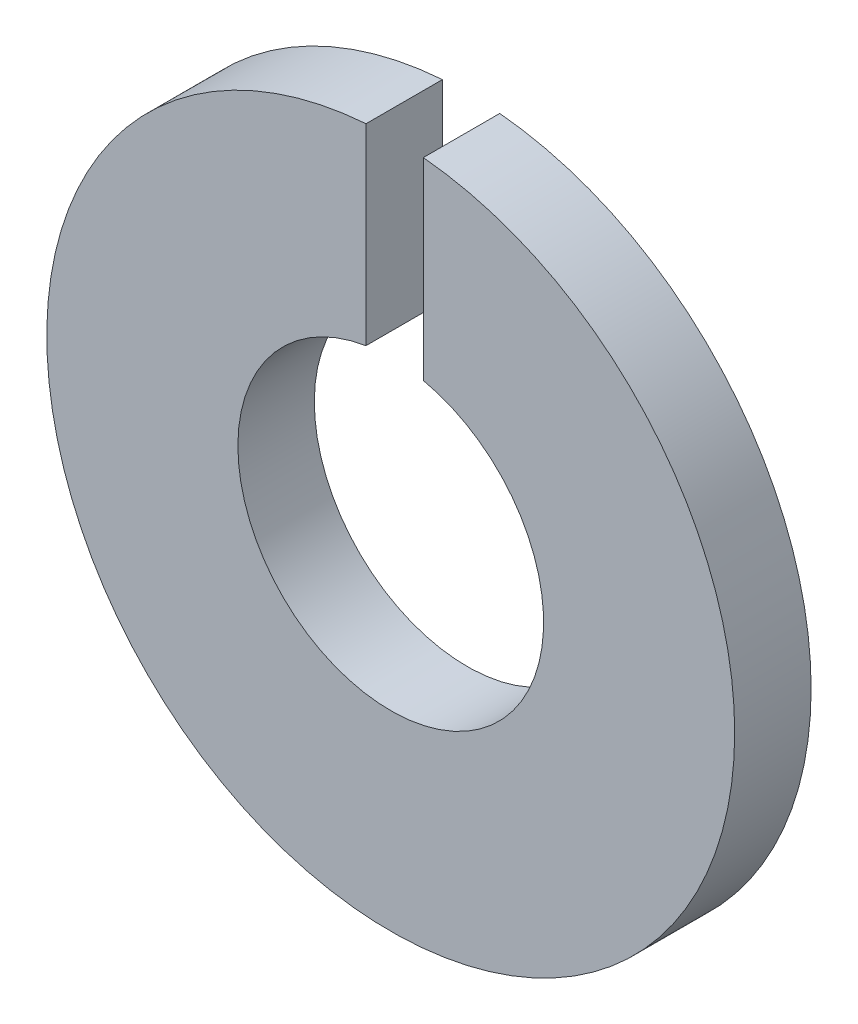
ISO-10303-21;
HEADER;
FILE_DESCRIPTION(('STEP AP214'),'2;1');
FILE_NAME('part.step','',(''),(''),'','','');
FILE_SCHEMA(('AUTOMOTIVE_DESIGN { 1 0 10303 214 1 1 1 1 }'));
ENDSEC;
DATA;
#1=APPLICATION_CONTEXT('core data for automotive mechanical design processes');
#2=APPLICATION_PROTOCOL_DEFINITION('international standard','automotive_design',2000,#1);
#3=PRODUCT_CONTEXT('',#1,'mechanical');
#4=PRODUCT('Part','Part','',(#3));
#5=PRODUCT_RELATED_PRODUCT_CATEGORY('part','',(#4));
#6=PRODUCT_DEFINITION_FORMATION('','',#4);
#7=PRODUCT_DEFINITION_CONTEXT('part definition',#1,'design');
#8=PRODUCT_DEFINITION('design','',#6,#7);
#9=PRODUCT_DEFINITION_SHAPE('','',#8);
#10=(LENGTH_UNIT() NAMED_UNIT(*) SI_UNIT(.MILLI.,.METRE.));
#11=(NAMED_UNIT(*) PLANE_ANGLE_UNIT() SI_UNIT($,.RADIAN.));
#12=(NAMED_UNIT(*) SI_UNIT($,.STERADIAN.) SOLID_ANGLE_UNIT());
#13=UNCERTAINTY_MEASURE_WITH_UNIT(LENGTH_MEASURE(1.E-05),#10,'distance_accuracy_value','');
#14=(GEOMETRIC_REPRESENTATION_CONTEXT(3) GLOBAL_UNCERTAINTY_ASSIGNED_CONTEXT((#13)) GLOBAL_UNIT_ASSIGNED_CONTEXT((#10,
#11,#12)) REPRESENTATION_CONTEXT('',''));
#15=CARTESIAN_POINT('',(0.,0.,0.));
#16=DIRECTION('',(0.,0.,1.));
#17=DIRECTION('',(1.,0.,0.));
#18=AXIS2_PLACEMENT_3D('',#15,#16,#17);
#19=CARTESIAN_POINT('',(0.,0.,2.));
#20=DIRECTION('',(0.,0.,-1.));
#21=DIRECTION('',(-1.,0.,0.));
#22=AXIS2_PLACEMENT_3D('',#19,#20,#21);
#23=CYLINDRICAL_SURFACE('',#22,9.);
#24=CARTESIAN_POINT('',(0.,0.,0.));
#25=DIRECTION('',(0.,0.,1.));
#26=DIRECTION('',(1.,0.,0.));
#27=AXIS2_PLACEMENT_3D('',#24,#25,#26);
#28=CIRCLE('',#27,9.);
#29=CARTESIAN_POINT('',(-0.647749549212959,8.9766597641603,0.));
#30=VERTEX_POINT('',#29);
#31=CARTESIAN_POINT('',(0.852250450787042,8.95955742038262,0.));
#32=VERTEX_POINT('',#31);
#33=EDGE_CURVE('E100',#30,#32,#28,.T.);
#34=ORIENTED_EDGE('',*,*,#33,.T.);
#35=DIRECTION('',(0.,0.,-1.));
#36=VECTOR('',#35,1.);
#37=CARTESIAN_POINT('',(0.852250450787042,8.95955742038262,2.));
#38=LINE('',#37,#36);
#39=CARTESIAN_POINT('',(0.852250450787042,8.95955742038262,2.));
#40=VERTEX_POINT('',#39);
#41=EDGE_CURVE('E11',#40,#32,#38,.T.);
#42=ORIENTED_EDGE('',*,*,#41,.F.);
#43=CARTESIAN_POINT('',(0.,0.,2.));
#44=DIRECTION('',(0.,0.,1.));
#45=DIRECTION('',(1.,0.,0.));
#46=AXIS2_PLACEMENT_3D('',#43,#44,#45);
#47=CIRCLE('',#46,9.);
#48=CARTESIAN_POINT('',(-0.647749549212959,8.9766597641603,2.));
#49=VERTEX_POINT('',#48);
#50=EDGE_CURVE('E88',#49,#40,#47,.T.);
#51=ORIENTED_EDGE('',*,*,#50,.F.);
#52=DIRECTION('',(0.,0.,-1.));
#53=VECTOR('',#52,1.);
#54=CARTESIAN_POINT('',(-0.647749549212959,8.9766597641603,2.));
#55=LINE('',#54,#53);
#56=EDGE_CURVE('E96',#49,#30,#55,.T.);
#57=ORIENTED_EDGE('',*,*,#56,.T.);
#58=EDGE_LOOP('',(#34,#42,#51,#57));
#59=FACE_BOUND('',#58,.T.);
#60=ADVANCED_FACE('F37',(#59),#23,.T.);
#61=CARTESIAN_POINT('',(0.852250450787042,8.95955742038262,2.));
#62=DIRECTION('',(1.,0.,0.));
#63=DIRECTION('',(0.,0.,-1.));
#64=AXIS2_PLACEMENT_3D('',#61,#62,#63);
#65=PLANE('',#64);
#66=DIRECTION('',(0.,-1.,0.));
#67=VECTOR('',#66,1.);
#68=CARTESIAN_POINT('',(0.852250450787042,8.95955742038262,0.));
#69=LINE('',#68,#67);
#70=CARTESIAN_POINT('',(0.852250450787042,3.90815418952903,0.));
#71=VERTEX_POINT('',#70);
#72=EDGE_CURVE('E92',#32,#71,#69,.T.);
#73=ORIENTED_EDGE('',*,*,#72,.T.);
#74=DIRECTION('',(0.,0.,-1.));
#75=VECTOR('',#74,1.);
#76=CARTESIAN_POINT('',(0.852250450787042,3.90815418952903,2.));
#77=LINE('',#76,#75);
#78=CARTESIAN_POINT('',(0.852250450787042,3.90815418952903,2.));
#79=VERTEX_POINT('',#78);
#80=EDGE_CURVE('E45',#79,#71,#77,.T.);
#81=ORIENTED_EDGE('',*,*,#80,.F.);
#82=DIRECTION('',(0.,-1.,0.));
#83=VECTOR('',#82,1.);
#84=CARTESIAN_POINT('',(0.852250450787042,8.95955742038262,2.));
#85=LINE('',#84,#83);
#86=EDGE_CURVE('E83',#40,#79,#85,.T.);
#87=ORIENTED_EDGE('',*,*,#86,.F.);
#88=ORIENTED_EDGE('',*,*,#41,.T.);
#89=EDGE_LOOP('',(#73,#81,#87,#88));
#90=FACE_BOUND('',#89,.T.);
#91=ADVANCED_FACE('F91',(#90),#65,.F.);
#92=CARTESIAN_POINT('',(0.,0.,2.));
#93=DIRECTION('',(0.,0.,-1.));
#94=DIRECTION('',(-1.,0.,0.));
#95=AXIS2_PLACEMENT_3D('',#92,#93,#94);
#96=CYLINDRICAL_SURFACE('',#95,4.);
#97=CARTESIAN_POINT('',(0.,0.,0.));
#98=DIRECTION('',(0.,0.,-1.));
#99=DIRECTION('',(1.,0.,0.));
#100=AXIS2_PLACEMENT_3D('',#97,#98,#99);
#101=CIRCLE('',#100,4.);
#102=CARTESIAN_POINT('',(-0.647749549212958,3.94720413983042,0.));
#103=VERTEX_POINT('',#102);
#104=EDGE_CURVE('E70',#71,#103,#101,.T.);
#105=ORIENTED_EDGE('',*,*,#104,.T.);
#106=DIRECTION('',(0.,0.,-1.));
#107=VECTOR('',#106,1.);
#108=CARTESIAN_POINT('',(-0.647749549212958,3.94720413983042,2.));
#109=LINE('',#108,#107);
#110=CARTESIAN_POINT('',(-0.647749549212958,3.94720413983042,2.));
#111=VERTEX_POINT('',#110);
#112=EDGE_CURVE('E93',#111,#103,#109,.T.);
#113=ORIENTED_EDGE('',*,*,#112,.F.);
#114=CARTESIAN_POINT('',(0.,0.,2.));
#115=DIRECTION('',(0.,0.,-1.));
#116=DIRECTION('',(1.,0.,0.));
#117=AXIS2_PLACEMENT_3D('',#114,#115,#116);
#118=CIRCLE('',#117,4.);
#119=EDGE_CURVE('E86',#79,#111,#118,.T.);
#120=ORIENTED_EDGE('',*,*,#119,.F.);
#121=ORIENTED_EDGE('',*,*,#80,.T.);
#122=EDGE_LOOP('',(#105,#113,#120,#121));
#123=FACE_BOUND('',#122,.T.);
#124=ADVANCED_FACE('F94',(#123),#96,.F.);
#125=CARTESIAN_POINT('',(-0.647749549212959,8.9766597641603,2.));
#126=DIRECTION('',(-1.,0.,0.));
#127=DIRECTION('',(0.,-1.,0.));
#128=AXIS2_PLACEMENT_3D('',#125,#126,#127);
#129=PLANE('',#128);
#130=DIRECTION('',(0.,1.,0.));
#131=VECTOR('',#130,1.);
#132=CARTESIAN_POINT('',(-0.647749549212959,8.9766597641603,0.));
#133=LINE('',#132,#131);
#134=EDGE_CURVE('E76',#103,#30,#133,.T.);
#135=ORIENTED_EDGE('',*,*,#134,.T.);
#136=ORIENTED_EDGE('',*,*,#56,.F.);
#137=DIRECTION('',(0.,1.,0.));
#138=VECTOR('',#137,1.);
#139=CARTESIAN_POINT('',(-0.647749549212959,8.9766597641603,2.));
#140=LINE('',#139,#138);
#141=EDGE_CURVE('E53',#111,#49,#140,.T.);
#142=ORIENTED_EDGE('',*,*,#141,.F.);
#143=ORIENTED_EDGE('',*,*,#112,.T.);
#144=EDGE_LOOP('',(#135,#136,#142,#143));
#145=FACE_BOUND('',#144,.T.);
#146=ADVANCED_FACE('F107',(#145),#129,.F.);
#147=CARTESIAN_POINT('',(0.,0.,2.));
#148=DIRECTION('',(0.,0.,1.));
#149=DIRECTION('',(1.,0.,0.));
#150=AXIS2_PLACEMENT_3D('',#147,#148,#149);
#151=PLANE('',#150);
#152=ORIENTED_EDGE('',*,*,#50,.T.);
#153=ORIENTED_EDGE('',*,*,#86,.T.);
#154=ORIENTED_EDGE('',*,*,#119,.T.);
#155=ORIENTED_EDGE('',*,*,#141,.T.);
#156=EDGE_LOOP('',(#152,#153,#154,#155));
#157=FACE_BOUND('',#156,.T.);
#158=ADVANCED_FACE('F84',(#157),#151,.T.);
#159=CARTESIAN_POINT('',(0.,0.,0.));
#160=DIRECTION('',(0.,0.,1.));
#161=DIRECTION('',(1.,0.,0.));
#162=AXIS2_PLACEMENT_3D('',#159,#160,#161);
#163=PLANE('',#162);
#164=ORIENTED_EDGE('',*,*,#33,.F.);
#165=ORIENTED_EDGE('',*,*,#134,.F.);
#166=ORIENTED_EDGE('',*,*,#104,.F.);
#167=ORIENTED_EDGE('',*,*,#72,.F.);
#168=EDGE_LOOP('',(#164,#165,#166,#167));
#169=FACE_BOUND('',#168,.T.);
#170=ADVANCED_FACE('F110',(#169),#163,.F.);
#171=CLOSED_SHELL('',(#60,#91,#124,#146,#158,#170));
#172=MANIFOLD_SOLID_BREP('B2',#171);
#173=ADVANCED_BREP_SHAPE_REPRESENTATION('',(#18,#172),#14);
#174=SHAPE_DEFINITION_REPRESENTATION(#9,#173);
ENDSEC;
END-ISO-10303-21;
